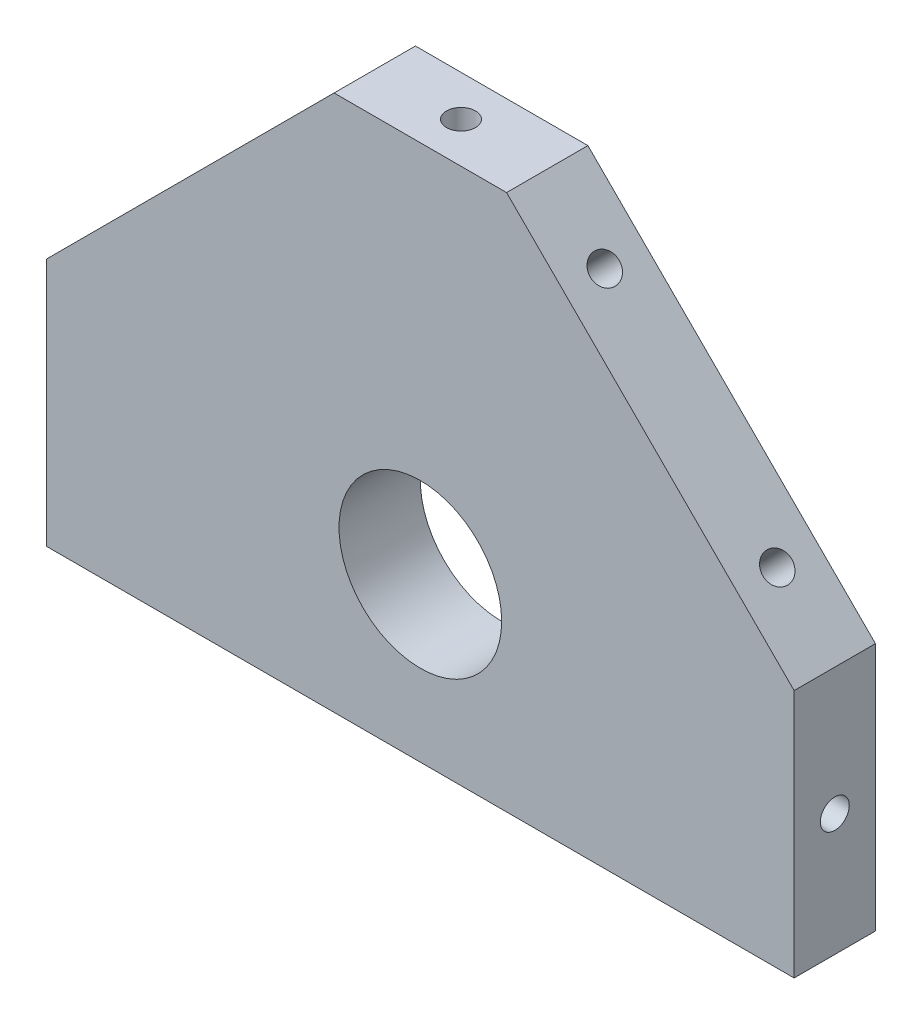
ISO-10303-21;
HEADER;
FILE_DESCRIPTION(('STEP AP214'),'2;1');
FILE_NAME('part.step','',(''),(''),'','','');
FILE_SCHEMA(('AUTOMOTIVE_DESIGN { 1 0 10303 214 1 1 1 1 }'));
ENDSEC;
DATA;
#1=APPLICATION_CONTEXT('core data for automotive mechanical design processes');
#2=APPLICATION_PROTOCOL_DEFINITION('international standard','automotive_design',2000,#1);
#3=PRODUCT_CONTEXT('',#1,'mechanical');
#4=PRODUCT('Part','Part','',(#3));
#5=PRODUCT_RELATED_PRODUCT_CATEGORY('part','',(#4));
#6=PRODUCT_DEFINITION_FORMATION('','',#4);
#7=PRODUCT_DEFINITION_CONTEXT('part definition',#1,'design');
#8=PRODUCT_DEFINITION('design','',#6,#7);
#9=PRODUCT_DEFINITION_SHAPE('','',#8);
#10=(LENGTH_UNIT() NAMED_UNIT(*) SI_UNIT(.MILLI.,.METRE.));
#11=(NAMED_UNIT(*) PLANE_ANGLE_UNIT() SI_UNIT($,.RADIAN.));
#12=(NAMED_UNIT(*) SI_UNIT($,.STERADIAN.) SOLID_ANGLE_UNIT());
#13=UNCERTAINTY_MEASURE_WITH_UNIT(LENGTH_MEASURE(1.E-05),#10,'distance_accuracy_value','');
#14=(GEOMETRIC_REPRESENTATION_CONTEXT(3) GLOBAL_UNCERTAINTY_ASSIGNED_CONTEXT((#13)) GLOBAL_UNIT_ASSIGNED_CONTEXT((#10,
#11,#12)) REPRESENTATION_CONTEXT('',''));
#15=CARTESIAN_POINT('',(0.,0.,0.));
#16=DIRECTION('',(0.,0.,1.));
#17=DIRECTION('',(1.,0.,0.));
#18=AXIS2_PLACEMENT_3D('',#15,#16,#17);
#19=CARTESIAN_POINT('',(0.,-12.7,3.175));
#20=DIRECTION('',(0.,1.,0.));
#21=DIRECTION('',(0.,0.,1.));
#22=AXIS2_PLACEMENT_3D('',#19,#20,#21);
#23=PLANE('',#22);
#24=CARTESIAN_POINT('',(15.875,-12.7,0.));
#25=DIRECTION('',(0.,-1.,0.));
#26=DIRECTION('',(0.,0.,-1.));
#27=AXIS2_PLACEMENT_3D('',#24,#25,#26);
#28=CIRCLE('',#27,1.13029999999999);
#29=CARTESIAN_POINT('',(15.875,-12.7,-1.13029999999999));
#30=VERTEX_POINT('',#29);
#31=EDGE_CURVE('E203',#30,#30,#28,.T.);
#32=ORIENTED_EDGE('',*,*,#31,.F.);
#33=EDGE_LOOP('',(#32));
#34=FACE_BOUND('',#33,.T.);
#35=DIRECTION('',(1.,0.,0.));
#36=VECTOR('',#35,1.);
#37=CARTESIAN_POINT('',(0.,-12.7,-3.175));
#38=LINE('',#37,#36);
#39=CARTESIAN_POINT('',(-29.1846,-12.7,-3.175));
#40=VERTEX_POINT('',#39);
#41=CARTESIAN_POINT('',(29.1846,-12.7,-3.175));
#42=VERTEX_POINT('',#41);
#43=EDGE_CURVE('E209',#40,#42,#38,.T.);
#44=ORIENTED_EDGE('',*,*,#43,.T.);
#45=DIRECTION('',(0.,0.,-1.));
#46=VECTOR('',#45,1.);
#47=CARTESIAN_POINT('',(29.1846,-12.7,3.175));
#48=LINE('',#47,#46);
#49=CARTESIAN_POINT('',(29.1846,-12.7,3.175));
#50=VERTEX_POINT('',#49);
#51=EDGE_CURVE('E11',#50,#42,#48,.T.);
#52=ORIENTED_EDGE('',*,*,#51,.F.);
#53=DIRECTION('',(1.,0.,0.));
#54=VECTOR('',#53,1.);
#55=CARTESIAN_POINT('',(0.,-12.7,3.175));
#56=LINE('',#55,#54);
#57=CARTESIAN_POINT('',(-29.1846,-12.7,3.175));
#58=VERTEX_POINT('',#57);
#59=EDGE_CURVE('E78',#58,#50,#56,.T.);
#60=ORIENTED_EDGE('',*,*,#59,.F.);
#61=DIRECTION('',(0.,0.,-1.));
#62=VECTOR('',#61,1.);
#63=CARTESIAN_POINT('',(-29.1846,-12.7,3.175));
#64=LINE('',#63,#62);
#65=EDGE_CURVE('E176',#58,#40,#64,.T.);
#66=ORIENTED_EDGE('',*,*,#65,.T.);
#67=EDGE_LOOP('',(#44,#52,#60,#66));
#68=FACE_BOUND('',#67,.T.);
#69=CARTESIAN_POINT('',(-15.875,-12.7,0.));
#70=DIRECTION('',(0.,1.,0.));
#71=DIRECTION('',(0.,0.,-1.));
#72=AXIS2_PLACEMENT_3D('',#69,#70,#71);
#73=CIRCLE('',#72,1.13029999999999);
#74=CARTESIAN_POINT('',(-15.875,-12.7,-1.13029999999999));
#75=VERTEX_POINT('',#74);
#76=EDGE_CURVE('E152',#75,#75,#73,.T.);
#77=ORIENTED_EDGE('',*,*,#76,.T.);
#78=EDGE_LOOP('',(#77));
#79=FACE_BOUND('',#78,.T.);
#80=ADVANCED_FACE('F38',(#34,#68,#79),#23,.F.);
#81=CARTESIAN_POINT('',(29.1846,-12.7,3.175));
#82=DIRECTION('',(-1.,0.,0.));
#83=DIRECTION('',(0.,0.,1.));
#84=AXIS2_PLACEMENT_3D('',#81,#82,#83);
#85=PLANE('',#84);
#86=CARTESIAN_POINT('',(29.1846,-3.175,0.));
#87=DIRECTION('',(1.,0.,0.));
#88=DIRECTION('',(0.,0.,-1.));
#89=AXIS2_PLACEMENT_3D('',#86,#87,#88);
#90=CIRCLE('',#89,1.13029999999999);
#91=CARTESIAN_POINT('',(29.1846,-3.175,-1.13029999999999));
#92=VERTEX_POINT('',#91);
#93=EDGE_CURVE('E191',#92,#92,#90,.T.);
#94=ORIENTED_EDGE('',*,*,#93,.F.);
#95=EDGE_LOOP('',(#94));
#96=FACE_BOUND('',#95,.T.);
#97=DIRECTION('',(0.,1.,0.));
#98=VECTOR('',#97,1.);
#99=CARTESIAN_POINT('',(29.1846,-12.7,-3.175));
#100=LINE('',#99,#98);
#101=CARTESIAN_POINT('',(29.1846,6.73395969732699,-3.175));
#102=VERTEX_POINT('',#101);
#103=EDGE_CURVE('E68',#42,#102,#100,.T.);
#104=ORIENTED_EDGE('',*,*,#103,.T.);
#105=DIRECTION('',(0.,0.,-1.));
#106=VECTOR('',#105,1.);
#107=CARTESIAN_POINT('',(29.1846,6.73395969732699,3.175));
#108=LINE('',#107,#106);
#109=CARTESIAN_POINT('',(29.1846,6.73395969732699,3.175));
#110=VERTEX_POINT('',#109);
#111=EDGE_CURVE('E46',#110,#102,#108,.T.);
#112=ORIENTED_EDGE('',*,*,#111,.F.);
#113=DIRECTION('',(0.,1.,0.));
#114=VECTOR('',#113,1.);
#115=CARTESIAN_POINT('',(29.1846,-12.7,3.175));
#116=LINE('',#115,#114);
#117=EDGE_CURVE('E211',#50,#110,#116,.T.);
#118=ORIENTED_EDGE('',*,*,#117,.F.);
#119=ORIENTED_EDGE('',*,*,#51,.T.);
#120=EDGE_LOOP('',(#104,#112,#118,#119));
#121=FACE_BOUND('',#120,.T.);
#122=ADVANCED_FACE('F242',(#96,#121),#85,.F.);
#123=CARTESIAN_POINT('',(29.1846,6.73395969732699,3.175));
#124=DIRECTION('',(-0.70710678118655,-0.707106781186545,0.));
#125=DIRECTION('',(0.707106781186545,-0.70710678118655,0.));
#126=AXIS2_PLACEMENT_3D('',#123,#124,#125);
#127=PLANE('',#126);
#128=CARTESIAN_POINT('',(11.2240877578618,24.6944719394654,0.));
#129=DIRECTION('',(0.70710678118655,0.707106781186545,0.));
#130=DIRECTION('',(-0.707106781186545,0.70710678118655,0.));
#131=AXIS2_PLACEMENT_3D('',#128,#129,#130);
#132=CIRCLE('',#131,1.13029999999999);
#133=CARTESIAN_POINT('',(10.4248449630866,25.4937147342405,0.));
#134=VERTEX_POINT('',#133);
#135=EDGE_CURVE('E179',#134,#134,#132,.T.);
#136=ORIENTED_EDGE('',*,*,#135,.F.);
#137=EDGE_LOOP('',(#136));
#138=FACE_BOUND('',#137,.T.);
#139=CARTESIAN_POINT('',(24.6944719394654,11.2240877578616,0.));
#140=DIRECTION('',(0.70710678118655,0.707106781186545,0.));
#141=DIRECTION('',(-0.707106781186545,0.70710678118655,0.));
#142=AXIS2_PLACEMENT_3D('',#139,#140,#141);
#143=CIRCLE('',#142,1.13029999999999);
#144=CARTESIAN_POINT('',(23.8952291446903,12.0233305526367,0.));
#145=VERTEX_POINT('',#144);
#146=EDGE_CURVE('E185',#145,#145,#143,.T.);
#147=ORIENTED_EDGE('',*,*,#146,.F.);
#148=EDGE_LOOP('',(#147));
#149=FACE_BOUND('',#148,.T.);
#150=DIRECTION('',(-0.707106781186545,0.70710678118655,0.));
#151=VECTOR('',#150,1.);
#152=CARTESIAN_POINT('',(29.1846,6.73395969732699,-3.175));
#153=LINE('',#152,#151);
#154=CARTESIAN_POINT('',(6.73395969732719,29.1845999999999,-3.175));
#155=VERTEX_POINT('',#154);
#156=EDGE_CURVE('E73',#102,#155,#153,.T.);
#157=ORIENTED_EDGE('',*,*,#156,.T.);
#158=DIRECTION('',(0.,0.,-1.));
#159=VECTOR('',#158,1.);
#160=CARTESIAN_POINT('',(6.73395969732719,29.1845999999999,3.175));
#161=LINE('',#160,#159);
#162=CARTESIAN_POINT('',(6.73395969732719,29.1845999999999,3.175));
#163=VERTEX_POINT('',#162);
#164=EDGE_CURVE('E217',#163,#155,#161,.T.);
#165=ORIENTED_EDGE('',*,*,#164,.F.);
#166=DIRECTION('',(-0.707106781186545,0.70710678118655,0.));
#167=VECTOR('',#166,1.);
#168=CARTESIAN_POINT('',(29.1846,6.73395969732699,3.175));
#169=LINE('',#168,#167);
#170=EDGE_CURVE('E54',#110,#163,#169,.T.);
#171=ORIENTED_EDGE('',*,*,#170,.F.);
#172=ORIENTED_EDGE('',*,*,#111,.T.);
#173=EDGE_LOOP('',(#157,#165,#171,#172));
#174=FACE_BOUND('',#173,.T.);
#175=ADVANCED_FACE('F222',(#138,#149,#174),#127,.F.);
#176=CARTESIAN_POINT('',(6.73395969732719,29.1845999999999,3.175));
#177=DIRECTION('',(0.,-1.,0.));
#178=DIRECTION('',(1.,0.,0.));
#179=AXIS2_PLACEMENT_3D('',#176,#177,#178);
#180=PLANE('',#179);
#181=DIRECTION('',(-1.,0.,0.));
#182=VECTOR('',#181,1.);
#183=CARTESIAN_POINT('',(6.73395969732719,29.1845999999999,-3.175));
#184=LINE('',#183,#182);
#185=CARTESIAN_POINT('',(-6.7339596973272,29.1845999999999,-3.175));
#186=VERTEX_POINT('',#185);
#187=EDGE_CURVE('E212',#155,#186,#184,.T.);
#188=ORIENTED_EDGE('',*,*,#187,.T.);
#189=DIRECTION('',(0.,0.,-1.));
#190=VECTOR('',#189,1.);
#191=CARTESIAN_POINT('',(-6.7339596973272,29.1845999999999,3.175));
#192=LINE('',#191,#190);
#193=CARTESIAN_POINT('',(-6.7339596973272,29.1845999999999,3.175));
#194=VERTEX_POINT('',#193);
#195=EDGE_CURVE('E166',#194,#186,#192,.T.);
#196=ORIENTED_EDGE('',*,*,#195,.F.);
#197=DIRECTION('',(-1.,0.,0.));
#198=VECTOR('',#197,1.);
#199=CARTESIAN_POINT('',(6.73395969732719,29.1845999999999,3.175));
#200=LINE('',#199,#198);
#201=EDGE_CURVE('E215',#163,#194,#200,.T.);
#202=ORIENTED_EDGE('',*,*,#201,.F.);
#203=ORIENTED_EDGE('',*,*,#164,.T.);
#204=EDGE_LOOP('',(#188,#196,#202,#203));
#205=FACE_BOUND('',#204,.T.);
#206=CARTESIAN_POINT('',(0.,29.1845999999999,0.));
#207=DIRECTION('',(0.,1.,0.));
#208=DIRECTION('',(0.,0.,1.));
#209=AXIS2_PLACEMENT_3D('',#206,#207,#208);
#210=CIRCLE('',#209,1.13029999999999);
#211=CARTESIAN_POINT('',(0.,29.1845999999999,1.13029999999999));
#212=VERTEX_POINT('',#211);
#213=EDGE_CURVE('E197',#212,#212,#210,.T.);
#214=ORIENTED_EDGE('',*,*,#213,.F.);
#215=EDGE_LOOP('',(#214));
#216=FACE_BOUND('',#215,.T.);
#217=ADVANCED_FACE('F229',(#205,#216),#180,.F.);
#218=CARTESIAN_POINT('',(0.,-12.7,3.175));
#219=DIRECTION('',(0.,0.,1.));
#220=DIRECTION('',(1.,0.,0.));
#221=AXIS2_PLACEMENT_3D('',#218,#219,#220);
#222=PLANE('',#221);
#223=CARTESIAN_POINT('',(0.,0.,3.175));
#224=DIRECTION('',(0.,0.,1.));
#225=DIRECTION('',(1.,0.,0.));
#226=AXIS2_PLACEMENT_3D('',#223,#224,#225);
#227=CIRCLE('',#226,6.35);
#228=CARTESIAN_POINT('',(6.35,0.,3.175));
#229=VERTEX_POINT('',#228);
#230=EDGE_CURVE('E343',#229,#229,#227,.T.);
#231=ORIENTED_EDGE('',*,*,#230,.F.);
#232=EDGE_LOOP('',(#231));
#233=FACE_BOUND('',#232,.T.);
#234=ORIENTED_EDGE('',*,*,#201,.T.);
#235=DIRECTION('',(0.707106781186545,0.70710678118655,0.));
#236=VECTOR('',#235,1.);
#237=CARTESIAN_POINT('',(-29.1846,6.73395969732698,3.175));
#238=LINE('',#237,#236);
#239=CARTESIAN_POINT('',(-29.1846,6.73395969732698,3.175));
#240=VERTEX_POINT('',#239);
#241=EDGE_CURVE('E162',#240,#194,#238,.T.);
#242=ORIENTED_EDGE('',*,*,#241,.F.);
#243=DIRECTION('',(0.,1.,0.));
#244=VECTOR('',#243,1.);
#245=CARTESIAN_POINT('',(-29.1846,-12.7,3.175));
#246=LINE('',#245,#244);
#247=EDGE_CURVE('E159',#58,#240,#246,.T.);
#248=ORIENTED_EDGE('',*,*,#247,.F.);
#249=ORIENTED_EDGE('',*,*,#59,.T.);
#250=ORIENTED_EDGE('',*,*,#117,.T.);
#251=ORIENTED_EDGE('',*,*,#170,.T.);
#252=EDGE_LOOP('',(#234,#242,#248,#249,#250,#251));
#253=FACE_BOUND('',#252,.T.);
#254=ADVANCED_FACE('F235',(#233,#253),#222,.T.);
#255=CARTESIAN_POINT('',(0.,-12.7,-3.175));
#256=DIRECTION('',(0.,0.,1.));
#257=DIRECTION('',(1.,0.,0.));
#258=AXIS2_PLACEMENT_3D('',#255,#256,#257);
#259=PLANE('',#258);
#260=CARTESIAN_POINT('',(0.,0.,-3.175));
#261=DIRECTION('',(0.,0.,1.));
#262=DIRECTION('',(1.,0.,0.));
#263=AXIS2_PLACEMENT_3D('',#260,#261,#262);
#264=CIRCLE('',#263,6.35);
#265=CARTESIAN_POINT('',(6.35,0.,-3.175));
#266=VERTEX_POINT('',#265);
#267=EDGE_CURVE('E140',#266,#266,#264,.T.);
#268=ORIENTED_EDGE('',*,*,#267,.T.);
#269=EDGE_LOOP('',(#268));
#270=FACE_BOUND('',#269,.T.);
#271=ORIENTED_EDGE('',*,*,#43,.F.);
#272=DIRECTION('',(0.,1.,0.));
#273=VECTOR('',#272,1.);
#274=CARTESIAN_POINT('',(-29.1846,-12.7,-3.175));
#275=LINE('',#274,#273);
#276=CARTESIAN_POINT('',(-29.1846,6.73395969732698,-3.175));
#277=VERTEX_POINT('',#276);
#278=EDGE_CURVE('E158',#40,#277,#275,.T.);
#279=ORIENTED_EDGE('',*,*,#278,.T.);
#280=DIRECTION('',(0.707106781186545,0.70710678118655,0.));
#281=VECTOR('',#280,1.);
#282=CARTESIAN_POINT('',(-29.1846,6.73395969732698,-3.175));
#283=LINE('',#282,#281);
#284=EDGE_CURVE('E163',#277,#186,#283,.T.);
#285=ORIENTED_EDGE('',*,*,#284,.T.);
#286=ORIENTED_EDGE('',*,*,#187,.F.);
#287=ORIENTED_EDGE('',*,*,#156,.F.);
#288=ORIENTED_EDGE('',*,*,#103,.F.);
#289=EDGE_LOOP('',(#271,#279,#285,#286,#287,#288));
#290=FACE_BOUND('',#289,.T.);
#291=ADVANCED_FACE('F226',(#270,#290),#259,.F.);
#292=CARTESIAN_POINT('',(15.875,-3.04800000000001,0.));
#293=DIRECTION('',(0.,-1.,0.));
#294=DIRECTION('',(0.,0.,-1.));
#295=AXIS2_PLACEMENT_3D('',#292,#293,#294);
#296=CONICAL_SURFACE('',#295,1.13029999999999,1.02974425867665);
#297=CARTESIAN_POINT('',(15.875,-2.36884724231316,0.));
#298=VERTEX_POINT('',#297);
#299=VERTEX_LOOP('',#298);
#300=FACE_BOUND('',#299,.T.);
#301=CARTESIAN_POINT('',(15.875,-3.04800000000001,0.));
#302=DIRECTION('',(0.,-1.,0.));
#303=DIRECTION('',(0.,0.,-1.));
#304=AXIS2_PLACEMENT_3D('',#301,#302,#303);
#305=CIRCLE('',#304,1.13029999999999);
#306=CARTESIAN_POINT('',(15.875,-3.04800000000001,-1.13029999999999));
#307=VERTEX_POINT('',#306);
#308=EDGE_CURVE('E206',#307,#307,#305,.T.);
#309=ORIENTED_EDGE('',*,*,#308,.T.);
#310=EDGE_LOOP('',(#309));
#311=FACE_BOUND('',#310,.T.);
#312=ADVANCED_FACE('F258',(#300,#311),#296,.F.);
#313=CARTESIAN_POINT('',(15.875,-12.7,0.));
#314=DIRECTION('',(0.,-1.,0.));
#315=DIRECTION('',(0.,0.,-1.));
#316=AXIS2_PLACEMENT_3D('',#313,#314,#315);
#317=CYLINDRICAL_SURFACE('',#316,1.13029999999999);
#318=ORIENTED_EDGE('',*,*,#308,.F.);
#319=EDGE_LOOP('',(#318));
#320=FACE_BOUND('',#319,.T.);
#321=ORIENTED_EDGE('',*,*,#31,.T.);
#322=EDGE_LOOP('',(#321));
#323=FACE_BOUND('',#322,.T.);
#324=ADVANCED_FACE('F265',(#320,#323),#317,.F.);
#325=CARTESIAN_POINT('',(0.,29.1845999999999,0.));
#326=DIRECTION('',(0.,1.,0.));
#327=DIRECTION('',(0.,0.,1.));
#328=AXIS2_PLACEMENT_3D('',#325,#326,#327);
#329=CYLINDRICAL_SURFACE('',#328,1.13029999999999);
#330=ORIENTED_EDGE('',*,*,#213,.T.);
#331=EDGE_LOOP('',(#330));
#332=FACE_BOUND('',#331,.T.);
#333=CARTESIAN_POINT('',(0.,19.5326,0.));
#334=DIRECTION('',(0.,1.,0.));
#335=DIRECTION('',(0.,0.,1.));
#336=AXIS2_PLACEMENT_3D('',#333,#334,#335);
#337=CIRCLE('',#336,1.13029999999999);
#338=CARTESIAN_POINT('',(0.,19.5326,1.13029999999999));
#339=VERTEX_POINT('',#338);
#340=EDGE_CURVE('E200',#339,#339,#337,.T.);
#341=ORIENTED_EDGE('',*,*,#340,.F.);
#342=EDGE_LOOP('',(#341));
#343=FACE_BOUND('',#342,.T.);
#344=ADVANCED_FACE('F269',(#332,#343),#329,.F.);
#345=CARTESIAN_POINT('',(0.,19.5326,0.));
#346=DIRECTION('',(0.,1.,0.));
#347=DIRECTION('',(0.,0.,1.));
#348=AXIS2_PLACEMENT_3D('',#345,#346,#347);
#349=CONICAL_SURFACE('',#348,1.13029999999999,1.02974425867665);
#350=ORIENTED_EDGE('',*,*,#340,.T.);
#351=EDGE_LOOP('',(#350));
#352=FACE_BOUND('',#351,.T.);
#353=CARTESIAN_POINT('',(0.,18.8534472423131,0.));
#354=VERTEX_POINT('',#353);
#355=VERTEX_LOOP('',#354);
#356=FACE_BOUND('',#355,.T.);
#357=ADVANCED_FACE('F271',(#352,#356),#349,.F.);
#358=CARTESIAN_POINT('',(19.5326,-3.175,0.));
#359=DIRECTION('',(1.,0.,0.));
#360=DIRECTION('',(0.,0.,-1.));
#361=AXIS2_PLACEMENT_3D('',#358,#359,#360);
#362=CONICAL_SURFACE('',#361,1.13029999999999,1.02974425867665);
#363=CARTESIAN_POINT('',(18.8534472423132,-3.175,0.));
#364=VERTEX_POINT('',#363);
#365=VERTEX_LOOP('',#364);
#366=FACE_BOUND('',#365,.T.);
#367=CARTESIAN_POINT('',(19.5326,-3.175,0.));
#368=DIRECTION('',(1.,0.,0.));
#369=DIRECTION('',(0.,0.,-1.));
#370=AXIS2_PLACEMENT_3D('',#367,#368,#369);
#371=CIRCLE('',#370,1.13029999999999);
#372=CARTESIAN_POINT('',(19.5326,-3.175,-1.13029999999999));
#373=VERTEX_POINT('',#372);
#374=EDGE_CURVE('E194',#373,#373,#371,.T.);
#375=ORIENTED_EDGE('',*,*,#374,.T.);
#376=EDGE_LOOP('',(#375));
#377=FACE_BOUND('',#376,.T.);
#378=ADVANCED_FACE('F274',(#366,#377),#362,.F.);
#379=CARTESIAN_POINT('',(29.1846,-3.175,0.));
#380=DIRECTION('',(1.,0.,0.));
#381=DIRECTION('',(0.,0.,-1.));
#382=AXIS2_PLACEMENT_3D('',#379,#380,#381);
#383=CYLINDRICAL_SURFACE('',#382,1.13029999999999);
#384=ORIENTED_EDGE('',*,*,#374,.F.);
#385=EDGE_LOOP('',(#384));
#386=FACE_BOUND('',#385,.T.);
#387=ORIENTED_EDGE('',*,*,#93,.T.);
#388=EDGE_LOOP('',(#387));
#389=FACE_BOUND('',#388,.T.);
#390=ADVANCED_FACE('F281',(#386,#389),#383,.F.);
#391=CARTESIAN_POINT('',(17.8694772874529,4.39909310584906,0.));
#392=DIRECTION('',(0.70710678118655,0.707106781186545,0.));
#393=DIRECTION('',(-0.707106781186545,0.70710678118655,0.));
#394=AXIS2_PLACEMENT_3D('',#391,#392,#393);
#395=CONICAL_SURFACE('',#394,1.13029999999999,1.02974425867665);
#396=CARTESIAN_POINT('',(17.3892437670309,3.91885958542714,0.));
#397=VERTEX_POINT('',#396);
#398=VERTEX_LOOP('',#397);
#399=FACE_BOUND('',#398,.T.);
#400=CARTESIAN_POINT('',(17.8694772874529,4.39909310584906,0.));
#401=DIRECTION('',(0.70710678118655,0.707106781186545,0.));
#402=DIRECTION('',(-0.707106781186545,0.70710678118655,0.));
#403=AXIS2_PLACEMENT_3D('',#400,#401,#402);
#404=CIRCLE('',#403,1.13029999999999);
#405=CARTESIAN_POINT('',(17.0702344926777,5.1983359006242,0.));
#406=VERTEX_POINT('',#405);
#407=EDGE_CURVE('E188',#406,#406,#404,.T.);
#408=ORIENTED_EDGE('',*,*,#407,.T.);
#409=EDGE_LOOP('',(#408));
#410=FACE_BOUND('',#409,.T.);
#411=ADVANCED_FACE('F285',(#399,#410),#395,.F.);
#412=CARTESIAN_POINT('',(24.6944719394654,11.2240877578616,0.));
#413=DIRECTION('',(0.70710678118655,0.707106781186545,0.));
#414=DIRECTION('',(-0.707106781186545,0.70710678118655,0.));
#415=AXIS2_PLACEMENT_3D('',#412,#413,#414);
#416=CYLINDRICAL_SURFACE('',#415,1.13029999999999);
#417=ORIENTED_EDGE('',*,*,#407,.F.);
#418=EDGE_LOOP('',(#417));
#419=FACE_BOUND('',#418,.T.);
#420=ORIENTED_EDGE('',*,*,#146,.T.);
#421=EDGE_LOOP('',(#420));
#422=FACE_BOUND('',#421,.T.);
#423=ADVANCED_FACE('F289',(#419,#422),#416,.F.);
#424=CARTESIAN_POINT('',(4.39909310584917,17.8694772874528,0.));
#425=DIRECTION('',(0.70710678118655,0.707106781186545,0.));
#426=DIRECTION('',(-0.707106781186545,0.70710678118655,0.));
#427=AXIS2_PLACEMENT_3D('',#424,#425,#426);
#428=CONICAL_SURFACE('',#427,1.13029999999999,1.02974425867665);
#429=CARTESIAN_POINT('',(3.91885958542726,17.3892437670309,0.));
#430=VERTEX_POINT('',#429);
#431=VERTEX_LOOP('',#430);
#432=FACE_BOUND('',#431,.T.);
#433=CARTESIAN_POINT('',(4.39909310584917,17.8694772874528,0.));
#434=DIRECTION('',(0.70710678118655,0.707106781186545,0.));
#435=DIRECTION('',(-0.707106781186545,0.70710678118655,0.));
#436=AXIS2_PLACEMENT_3D('',#433,#434,#435);
#437=CIRCLE('',#436,1.13029999999999);
#438=CARTESIAN_POINT('',(3.59985031107403,18.668720082228,0.));
#439=VERTEX_POINT('',#438);
#440=EDGE_CURVE('E182',#439,#439,#437,.T.);
#441=ORIENTED_EDGE('',*,*,#440,.T.);
#442=EDGE_LOOP('',(#441));
#443=FACE_BOUND('',#442,.T.);
#444=ADVANCED_FACE('F293',(#432,#443),#428,.F.);
#445=CARTESIAN_POINT('',(11.2240877578618,24.6944719394654,0.));
#446=DIRECTION('',(0.70710678118655,0.707106781186545,0.));
#447=DIRECTION('',(-0.707106781186545,0.70710678118655,0.));
#448=AXIS2_PLACEMENT_3D('',#445,#446,#447);
#449=CYLINDRICAL_SURFACE('',#448,1.13029999999999);
#450=ORIENTED_EDGE('',*,*,#440,.F.);
#451=EDGE_LOOP('',(#450));
#452=FACE_BOUND('',#451,.T.);
#453=ORIENTED_EDGE('',*,*,#135,.T.);
#454=EDGE_LOOP('',(#453));
#455=FACE_BOUND('',#454,.T.);
#456=ADVANCED_FACE('F297',(#452,#455),#449,.F.);
#457=CARTESIAN_POINT('',(-29.1846,-12.7,3.175));
#458=DIRECTION('',(1.,0.,0.));
#459=DIRECTION('',(0.,0.,1.));
#460=AXIS2_PLACEMENT_3D('',#457,#458,#459);
#461=PLANE('',#460);
#462=CARTESIAN_POINT('',(-29.1846,-3.17500000000001,0.));
#463=DIRECTION('',(1.,0.,0.));
#464=DIRECTION('',(0.,0.,-1.));
#465=AXIS2_PLACEMENT_3D('',#462,#463,#464);
#466=CIRCLE('',#465,1.13029999999999);
#467=CARTESIAN_POINT('',(-29.1846,-3.17500000000001,-1.13029999999999));
#468=VERTEX_POINT('',#467);
#469=EDGE_CURVE('E146',#468,#468,#466,.T.);
#470=ORIENTED_EDGE('',*,*,#469,.T.);
#471=EDGE_LOOP('',(#470));
#472=FACE_BOUND('',#471,.T.);
#473=ORIENTED_EDGE('',*,*,#278,.F.);
#474=ORIENTED_EDGE('',*,*,#65,.F.);
#475=ORIENTED_EDGE('',*,*,#247,.T.);
#476=DIRECTION('',(0.,0.,-1.));
#477=VECTOR('',#476,1.);
#478=CARTESIAN_POINT('',(-29.1846,6.73395969732698,3.175));
#479=LINE('',#478,#477);
#480=EDGE_CURVE('E173',#240,#277,#479,.T.);
#481=ORIENTED_EDGE('',*,*,#480,.T.);
#482=EDGE_LOOP('',(#473,#474,#475,#481));
#483=FACE_BOUND('',#482,.T.);
#484=ADVANCED_FACE('F239',(#472,#483),#461,.F.);
#485=CARTESIAN_POINT('',(-29.1846,6.73395969732698,3.175));
#486=DIRECTION('',(0.70710678118655,-0.707106781186545,0.));
#487=DIRECTION('',(-0.707106781186545,-0.70710678118655,0.));
#488=AXIS2_PLACEMENT_3D('',#485,#486,#487);
#489=PLANE('',#488);
#490=CARTESIAN_POINT('',(-11.2240877578618,24.6944719394654,0.));
#491=DIRECTION('',(0.70710678118655,-0.707106781186545,0.));
#492=DIRECTION('',(0.707106781186545,0.70710678118655,0.));
#493=AXIS2_PLACEMENT_3D('',#490,#491,#492);
#494=CIRCLE('',#493,1.13029999999999);
#495=CARTESIAN_POINT('',(-10.4248449630866,25.4937147342405,0.));
#496=VERTEX_POINT('',#495);
#497=EDGE_CURVE('E134',#496,#496,#494,.T.);
#498=ORIENTED_EDGE('',*,*,#497,.T.);
#499=EDGE_LOOP('',(#498));
#500=FACE_BOUND('',#499,.T.);
#501=CARTESIAN_POINT('',(-24.6944719394654,11.2240877578616,0.));
#502=DIRECTION('',(0.70710678118655,-0.707106781186545,0.));
#503=DIRECTION('',(0.707106781186545,0.70710678118655,0.));
#504=AXIS2_PLACEMENT_3D('',#501,#502,#503);
#505=CIRCLE('',#504,1.13029999999999);
#506=CARTESIAN_POINT('',(-23.8952291446903,12.0233305526367,0.));
#507=VERTEX_POINT('',#506);
#508=EDGE_CURVE('E133',#507,#507,#505,.T.);
#509=ORIENTED_EDGE('',*,*,#508,.T.);
#510=EDGE_LOOP('',(#509));
#511=FACE_BOUND('',#510,.T.);
#512=ORIENTED_EDGE('',*,*,#284,.F.);
#513=ORIENTED_EDGE('',*,*,#480,.F.);
#514=ORIENTED_EDGE('',*,*,#241,.T.);
#515=ORIENTED_EDGE('',*,*,#195,.T.);
#516=EDGE_LOOP('',(#512,#513,#514,#515));
#517=FACE_BOUND('',#516,.T.);
#518=ADVANCED_FACE('F233',(#500,#511,#517),#489,.F.);
#519=CARTESIAN_POINT('',(-15.875,-3.04800000000001,0.));
#520=DIRECTION('',(0.,-1.,0.));
#521=DIRECTION('',(0.,0.,-1.));
#522=AXIS2_PLACEMENT_3D('',#519,#520,#521);
#523=CONICAL_SURFACE('',#522,1.13029999999999,1.02974425867665);
#524=CARTESIAN_POINT('',(-15.875,-2.36884724231316,0.));
#525=VERTEX_POINT('',#524);
#526=VERTEX_LOOP('',#525);
#527=FACE_BOUND('',#526,.T.);
#528=CARTESIAN_POINT('',(-15.875,-3.04800000000001,0.));
#529=DIRECTION('',(0.,1.,0.));
#530=DIRECTION('',(0.,0.,-1.));
#531=AXIS2_PLACEMENT_3D('',#528,#529,#530);
#532=CIRCLE('',#531,1.13029999999999);
#533=CARTESIAN_POINT('',(-15.875,-3.04800000000001,-1.13029999999999));
#534=VERTEX_POINT('',#533);
#535=EDGE_CURVE('E155',#534,#534,#532,.T.);
#536=ORIENTED_EDGE('',*,*,#535,.F.);
#537=EDGE_LOOP('',(#536));
#538=FACE_BOUND('',#537,.T.);
#539=ADVANCED_FACE('F307',(#527,#538),#523,.F.);
#540=CARTESIAN_POINT('',(-15.875,-12.7,0.));
#541=DIRECTION('',(0.,-1.,0.));
#542=DIRECTION('',(0.,0.,-1.));
#543=AXIS2_PLACEMENT_3D('',#540,#541,#542);
#544=CYLINDRICAL_SURFACE('',#543,1.13029999999999);
#545=ORIENTED_EDGE('',*,*,#535,.T.);
#546=EDGE_LOOP('',(#545));
#547=FACE_BOUND('',#546,.T.);
#548=ORIENTED_EDGE('',*,*,#76,.F.);
#549=EDGE_LOOP('',(#548));
#550=FACE_BOUND('',#549,.T.);
#551=ADVANCED_FACE('F311',(#547,#550),#544,.F.);
#552=CARTESIAN_POINT('',(-19.5326,-3.175,0.));
#553=DIRECTION('',(-1.,0.,0.));
#554=DIRECTION('',(0.,0.,-1.));
#555=AXIS2_PLACEMENT_3D('',#552,#553,#554);
#556=CONICAL_SURFACE('',#555,1.13029999999999,1.02974425867665);
#557=CARTESIAN_POINT('',(-18.8534472423132,-3.17500000000001,0.));
#558=VERTEX_POINT('',#557);
#559=VERTEX_LOOP('',#558);
#560=FACE_BOUND('',#559,.T.);
#561=CARTESIAN_POINT('',(-19.5326,-3.175,0.));
#562=DIRECTION('',(1.,0.,0.));
#563=DIRECTION('',(0.,0.,-1.));
#564=AXIS2_PLACEMENT_3D('',#561,#562,#563);
#565=CIRCLE('',#564,1.13029999999999);
#566=CARTESIAN_POINT('',(-19.5326,-3.175,-1.13029999999999));
#567=VERTEX_POINT('',#566);
#568=EDGE_CURVE('E149',#567,#567,#565,.T.);
#569=ORIENTED_EDGE('',*,*,#568,.F.);
#570=EDGE_LOOP('',(#569));
#571=FACE_BOUND('',#570,.T.);
#572=ADVANCED_FACE('F315',(#560,#571),#556,.F.);
#573=CARTESIAN_POINT('',(-29.1846,-3.17500000000001,0.));
#574=DIRECTION('',(-1.,0.,0.));
#575=DIRECTION('',(0.,0.,-1.));
#576=AXIS2_PLACEMENT_3D('',#573,#574,#575);
#577=CYLINDRICAL_SURFACE('',#576,1.13029999999999);
#578=ORIENTED_EDGE('',*,*,#568,.T.);
#579=EDGE_LOOP('',(#578));
#580=FACE_BOUND('',#579,.T.);
#581=ORIENTED_EDGE('',*,*,#469,.F.);
#582=EDGE_LOOP('',(#581));
#583=FACE_BOUND('',#582,.T.);
#584=ADVANCED_FACE('F319',(#580,#583),#577,.F.);
#585=CARTESIAN_POINT('',(-17.8694772874529,4.39909310584905,0.));
#586=DIRECTION('',(-0.70710678118655,0.707106781186545,0.));
#587=DIRECTION('',(0.707106781186545,0.70710678118655,0.));
#588=AXIS2_PLACEMENT_3D('',#585,#586,#587);
#589=CONICAL_SURFACE('',#588,1.13029999999999,1.02974425867665);
#590=CARTESIAN_POINT('',(-17.3892437670309,3.91885958542714,0.));
#591=VERTEX_POINT('',#590);
#592=VERTEX_LOOP('',#591);
#593=FACE_BOUND('',#592,.T.);
#594=CARTESIAN_POINT('',(-17.8694772874529,4.39909310584905,0.));
#595=DIRECTION('',(0.70710678118655,-0.707106781186545,0.));
#596=DIRECTION('',(0.707106781186545,0.70710678118655,0.));
#597=AXIS2_PLACEMENT_3D('',#594,#595,#596);
#598=CIRCLE('',#597,1.13029999999999);
#599=CARTESIAN_POINT('',(-17.0702344926777,5.1983359006242,0.));
#600=VERTEX_POINT('',#599);
#601=EDGE_CURVE('E137',#600,#600,#598,.T.);
#602=ORIENTED_EDGE('',*,*,#601,.F.);
#603=EDGE_LOOP('',(#602));
#604=FACE_BOUND('',#603,.T.);
#605=ADVANCED_FACE('F323',(#593,#604),#589,.F.);
#606=CARTESIAN_POINT('',(-24.6944719394654,11.2240877578616,0.));
#607=DIRECTION('',(-0.70710678118655,0.707106781186545,0.));
#608=DIRECTION('',(0.707106781186545,0.70710678118655,0.));
#609=AXIS2_PLACEMENT_3D('',#606,#607,#608);
#610=CYLINDRICAL_SURFACE('',#609,1.13029999999999);
#611=ORIENTED_EDGE('',*,*,#601,.T.);
#612=EDGE_LOOP('',(#611));
#613=FACE_BOUND('',#612,.T.);
#614=ORIENTED_EDGE('',*,*,#508,.F.);
#615=EDGE_LOOP('',(#614));
#616=FACE_BOUND('',#615,.T.);
#617=ADVANCED_FACE('F127',(#613,#616),#610,.F.);
#618=CARTESIAN_POINT('',(-4.39909310584918,17.8694772874528,0.));
#619=DIRECTION('',(-0.70710678118655,0.707106781186545,0.));
#620=DIRECTION('',(0.707106781186545,0.70710678118655,0.));
#621=AXIS2_PLACEMENT_3D('',#618,#619,#620);
#622=CONICAL_SURFACE('',#621,1.13029999999999,1.02974425867665);
#623=CARTESIAN_POINT('',(-3.91885958542726,17.3892437670309,0.));
#624=VERTEX_POINT('',#623);
#625=VERTEX_LOOP('',#624);
#626=FACE_BOUND('',#625,.T.);
#627=CARTESIAN_POINT('',(-4.39909310584918,17.8694772874528,0.));
#628=DIRECTION('',(0.70710678118655,-0.707106781186545,0.));
#629=DIRECTION('',(0.707106781186545,0.70710678118655,0.));
#630=AXIS2_PLACEMENT_3D('',#627,#628,#629);
#631=CIRCLE('',#630,1.13029999999999);
#632=CARTESIAN_POINT('',(-3.59985031107404,18.668720082228,0.));
#633=VERTEX_POINT('',#632);
#634=EDGE_CURVE('E131',#633,#633,#631,.T.);
#635=ORIENTED_EDGE('',*,*,#634,.F.);
#636=EDGE_LOOP('',(#635));
#637=FACE_BOUND('',#636,.T.);
#638=ADVANCED_FACE('F123',(#626,#637),#622,.F.);
#639=CARTESIAN_POINT('',(-11.2240877578618,24.6944719394654,0.));
#640=DIRECTION('',(-0.70710678118655,0.707106781186545,0.));
#641=DIRECTION('',(0.707106781186545,0.70710678118655,0.));
#642=AXIS2_PLACEMENT_3D('',#639,#640,#641);
#643=CYLINDRICAL_SURFACE('',#642,1.13029999999999);
#644=ORIENTED_EDGE('',*,*,#634,.T.);
#645=EDGE_LOOP('',(#644));
#646=FACE_BOUND('',#645,.T.);
#647=ORIENTED_EDGE('',*,*,#497,.F.);
#648=EDGE_LOOP('',(#647));
#649=FACE_BOUND('',#648,.T.);
#650=ADVANCED_FACE('F126',(#646,#649),#643,.F.);
#651=CARTESIAN_POINT('',(0.,0.,-3.175));
#652=DIRECTION('',(0.,0.,1.));
#653=DIRECTION('',(1.,0.,0.));
#654=AXIS2_PLACEMENT_3D('',#651,#652,#653);
#655=CYLINDRICAL_SURFACE('',#654,6.35);
#656=ORIENTED_EDGE('',*,*,#267,.F.);
#657=EDGE_LOOP('',(#656));
#658=FACE_BOUND('',#657,.T.);
#659=ORIENTED_EDGE('',*,*,#230,.T.);
#660=EDGE_LOOP('',(#659));
#661=FACE_BOUND('',#660,.T.);
#662=ADVANCED_FACE('F333',(#658,#661),#655,.F.);
#663=CLOSED_SHELL('',(#80,#122,#175,#217,#254,#291,#312,#324,#344,#357,#378,#390,#411,#423,#444,
#456,#484,#518,#539,#551,#572,#584,#605,#617,#638,#650,#662));
#664=MANIFOLD_SOLID_BREP('B2',#663);
#665=ADVANCED_BREP_SHAPE_REPRESENTATION('',(#18,#664),#14);
#666=SHAPE_DEFINITION_REPRESENTATION(#9,#665);
ENDSEC;
END-ISO-10303-21;
